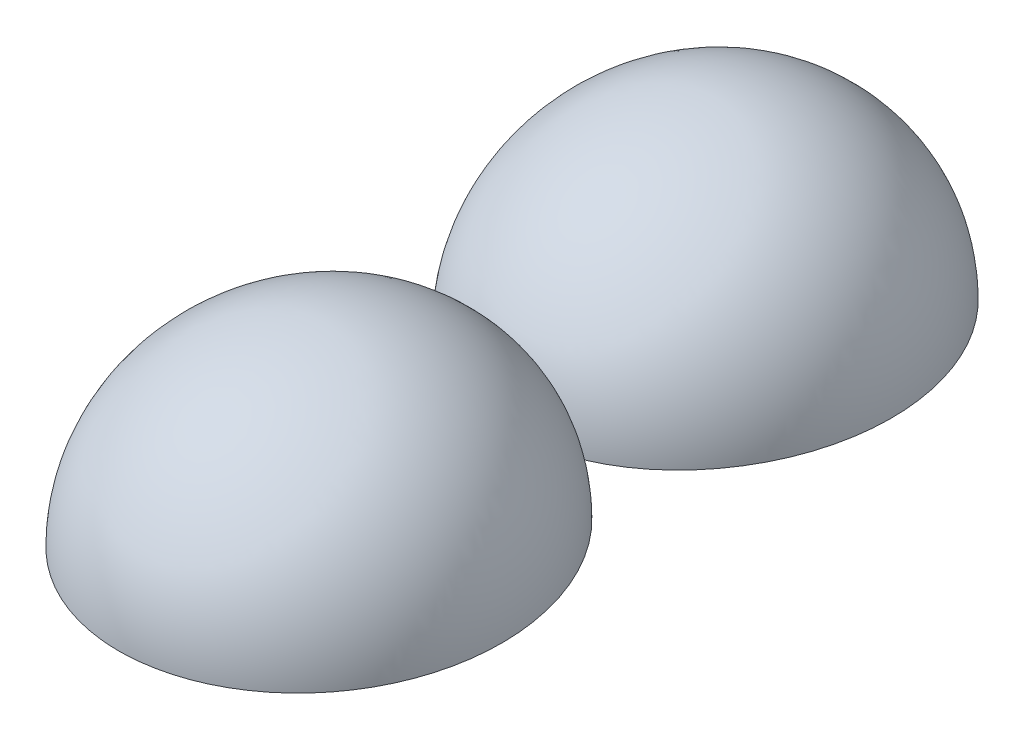
ISO-10303-21;
HEADER;
FILE_DESCRIPTION(('STEP AP214'),'2;1');
FILE_NAME('part.step','',(''),(''),'','','');
FILE_SCHEMA(('AUTOMOTIVE_DESIGN { 1 0 10303 214 1 1 1 1 }'));
ENDSEC;
DATA;
#1=APPLICATION_CONTEXT('core data for automotive mechanical design processes');
#2=APPLICATION_PROTOCOL_DEFINITION('international standard','automotive_design',2000,#1);
#3=PRODUCT_CONTEXT('',#1,'mechanical');
#4=PRODUCT('Part','Part','',(#3));
#5=PRODUCT_RELATED_PRODUCT_CATEGORY('part','',(#4));
#6=PRODUCT_DEFINITION_FORMATION('','',#4);
#7=PRODUCT_DEFINITION_CONTEXT('part definition',#1,'design');
#8=PRODUCT_DEFINITION('design','',#6,#7);
#9=PRODUCT_DEFINITION_SHAPE('','',#8);
#10=(LENGTH_UNIT() NAMED_UNIT(*) SI_UNIT(.MILLI.,.METRE.));
#11=(NAMED_UNIT(*) PLANE_ANGLE_UNIT() SI_UNIT($,.RADIAN.));
#12=(NAMED_UNIT(*) SI_UNIT($,.STERADIAN.) SOLID_ANGLE_UNIT());
#13=UNCERTAINTY_MEASURE_WITH_UNIT(LENGTH_MEASURE(1.E-05),#10,'distance_accuracy_value','');
#14=(GEOMETRIC_REPRESENTATION_CONTEXT(3) GLOBAL_UNCERTAINTY_ASSIGNED_CONTEXT((#13)) GLOBAL_UNIT_ASSIGNED_CONTEXT((#10,
#11,#12)) REPRESENTATION_CONTEXT('',''));
#15=CARTESIAN_POINT('',(0.,0.,0.));
#16=DIRECTION('',(0.,0.,1.));
#17=DIRECTION('',(1.,0.,0.));
#18=AXIS2_PLACEMENT_3D('',#15,#16,#17);
#19=CARTESIAN_POINT('',(3.06028735858265E-13,0.,21.3227192364473));
#20=CARTESIAN_POINT('',(-0.0605600851372698,0.,21.3227192364473));
#21=CARTESIAN_POINT('',(-0.180524470848123,0.,21.3196416488283));
#22=CARTESIAN_POINT('',(-0.367253435553289,0.,21.3081007327531));
#23=CARTESIAN_POINT('',(-0.555099954305753,0.,21.2828538482068));
#24=CARTESIAN_POINT('',(-0.716031376089089,0.,21.2543544839529));
#25=CARTESIAN_POINT('',(-0.844484831998398,0.,21.2271460866288));
#26=CARTESIAN_POINT('',(-1.00384668062234,0.,21.1877226172179));
#27=CARTESIAN_POINT('',(-1.19225597834348,0.,21.1319306277739));
#28=CARTESIAN_POINT('',(-1.40986644893566,0.,21.0543856421346));
#29=CARTESIAN_POINT('',(-1.65358201661449,0.,20.9495379866468));
#30=CARTESIAN_POINT('',(-1.91954629545271,0.,20.8149898556674));
#31=CARTESIAN_POINT('',(-2.20381439490061,0.,20.6455348772837));
#32=CARTESIAN_POINT('',(-2.50037552064583,0.,20.4374653876274));
#33=CARTESIAN_POINT('',(-2.80407151518409,0.,20.187245640245));
#34=CARTESIAN_POINT('',(-3.16020470363246,0.,19.8480703849216));
#35=CARTESIAN_POINT('',(-3.55002285408261,0.,19.404299117935));
#36=CARTESIAN_POINT('',(-3.95126616854423,0.,18.8437311144077));
#37=CARTESIAN_POINT('',(-4.43664961336897,0.,17.9905573006489));
#38=CARTESIAN_POINT('',(-4.89148726452149,0.,16.9017870305576));
#39=CARTESIAN_POINT('',(-5.25626167174152,0.,15.5734800440547));
#40=CARTESIAN_POINT('',(-5.47630484215257,0.,14.0155820653388));
#41=CARTESIAN_POINT('',(-5.52275474623004,0.,12.4409072350932));
#42=CARTESIAN_POINT('',(-5.41325463368996,0.,10.8698472301707));
#43=CARTESIAN_POINT('',(-5.1614088415779,0.,9.31556741862959));
#44=CARTESIAN_POINT('',(-4.777436955626,0.,7.78873548428225));
#45=CARTESIAN_POINT('',(-4.26875583085814,0.,6.29890695017353));
#46=CARTESIAN_POINT('',(-3.64033929904608,0.,4.85548320022228));
#47=CARTESIAN_POINT('',(-2.89456999099136,0.,3.46893515665885));
#48=CARTESIAN_POINT('',(-2.14256222285628,0.,2.32283287604823));
#49=CARTESIAN_POINT('',(-1.42614440038181,0.,1.40222976444919));
#50=CARTESIAN_POINT('',(-0.851142921162116,0.,0.768816275465535));
#51=CARTESIAN_POINT('',(-0.462580630449086,0.,0.387077097571633));
#52=CARTESIAN_POINT('',(-0.195923126656698,0.,0.152384324671856));
#53=CARTESIAN_POINT('',(-0.0663117351554884,0.,0.0495330631106812));
#54=CARTESIAN_POINT('',(0.,0.,0.));
#55=B_SPLINE_CURVE_WITH_KNOTS('',4,(#19,#20,#21,#22,#23,#24,#25,#26,#27,#28,#29,#30,#31,#32,#33,
#34,#35,#36,#37,#38,#39,#40,#41,#42,#43,#44,#45,#46,#47,#48,#49,#50,#51,#52,#53,#54),
.UNSPECIFIED.,.F.,.F.,(5,1,1,1,1,1,1,1,1,1,1,1,1,1,1,1,1,1,1,1,1,1,1,1,1,1,1,1,1,1,1,1,5),
(0.075727273648214,0.0852251902132587,0.0947231067783033,0.0994720692332456,0.104221031688188,
0.10896999414313,0.113718956598072,0.123216879822465,0.132714803046858,0.142432647675104,
0.15215049230335,0.166397447324557,0.180644402345764,0.194891233087148,0.209138063828531,
0.237631810695735,0.266125767747669,0.294619399363612,0.351197461360832,0.408185109509772,
0.465172649296407,0.522160251464682,0.579147822960017,0.636135418479735,0.693122967885307,
0.750110545802865,0.807098279092534,0.864085824216971,0.921073538054691,0.948543207210811,
0.97601287636693,0.988006438183465,1.),.UNSPECIFIED.);
#56=CARTESIAN_POINT('',(0.,0.,0.));
#57=DIRECTION('',(0.,0.,-1.));
#58=AXIS1_PLACEMENT('',#56,#57);
#59=SURFACE_OF_REVOLUTION('',#55,#58);
#60=CARTESIAN_POINT('',(-1.59744263229573E-13,0.,21.3227192364473));
#61=CARTESIAN_POINT('',(0.0605600851374161,0.,21.3227192364473));
#62=CARTESIAN_POINT('',(0.18052447084827,0.,21.3196416488283));
#63=CARTESIAN_POINT('',(0.367253435553436,0.,21.3081007327531));
#64=CARTESIAN_POINT('',(0.555099954305899,0.,21.2828538482068));
#65=CARTESIAN_POINT('',(0.716031376089234,0.,21.2543544839529));
#66=CARTESIAN_POINT('',(0.844484831998543,0.,21.2271460866288));
#67=CARTESIAN_POINT('',(1.00384668062249,0.,21.1877226172179));
#68=CARTESIAN_POINT('',(1.19225597834363,0.,21.1319306277738));
#69=CARTESIAN_POINT('',(1.40986644893581,0.,21.0543856421346));
#70=CARTESIAN_POINT('',(1.65358201661464,0.,20.9495379866467));
#71=CARTESIAN_POINT('',(1.91954629545285,0.,20.8149898556674));
#72=CARTESIAN_POINT('',(2.20381439490075,0.,20.6455348772837));
#73=CARTESIAN_POINT('',(2.50037552064597,0.,20.4374653876273));
#74=CARTESIAN_POINT('',(2.80407151518423,0.,20.187245640245));
#75=CARTESIAN_POINT('',(3.16020470363259,0.,19.8480703849216));
#76=CARTESIAN_POINT('',(3.55002285408275,0.,19.404299117935));
#77=CARTESIAN_POINT('',(3.95126616854436,0.,18.8437311144076));
#78=CARTESIAN_POINT('',(4.43664961336909,0.,17.9905573006488));
#79=CARTESIAN_POINT('',(4.89148726452161,0.,16.9017870305576));
#80=CARTESIAN_POINT('',(5.25626167174163,0.,15.5734800440547));
#81=CARTESIAN_POINT('',(5.47630484215267,0.,14.0155820653388));
#82=CARTESIAN_POINT('',(5.52275474623012,0.,12.4409072350931));
#83=CARTESIAN_POINT('',(5.41325463369003,0.,10.8698472301706));
#84=CARTESIAN_POINT('',(5.16140884157796,0.,9.31556741862955));
#85=CARTESIAN_POINT('',(4.77743695562606,0.,7.78873548428222));
#86=CARTESIAN_POINT('',(4.26875583085819,0.,6.2989069501735));
#87=CARTESIAN_POINT('',(3.64033929904611,0.,4.85548320022225));
#88=CARTESIAN_POINT('',(2.89456999099139,0.,3.46893515665883));
#89=CARTESIAN_POINT('',(2.1425622228563,0.,2.32283287604821));
#90=CARTESIAN_POINT('',(1.42614440038182,0.,1.40222976444918));
#91=CARTESIAN_POINT('',(0.851142921162121,0.,0.768816275465529));
#92=CARTESIAN_POINT('',(0.462580630449089,0.,0.387077097571629));
#93=CARTESIAN_POINT('',(0.195923126656699,0.,0.152384324671855));
#94=CARTESIAN_POINT('',(0.0663117351554888,0.,0.0495330631106807));
#95=CARTESIAN_POINT('',(0.,0.,0.));
#96=B_SPLINE_CURVE_WITH_KNOTS('',4,(#60,#61,#62,#63,#64,#65,#66,#67,#68,#69,#70,#71,#72,#73,#74,
#75,#76,#77,#78,#79,#80,#81,#82,#83,#84,#85,#86,#87,#88,#89,#90,#91,#92,#93,#94,#95),
.UNSPECIFIED.,.F.,.F.,(5,1,1,1,1,1,1,1,1,1,1,1,1,1,1,1,1,1,1,1,1,1,1,1,1,1,1,1,1,1,1,1,5),
(0.075727273648214,0.0852251902132587,0.0947231067783033,0.0994720692332456,0.104221031688188,
0.10896999414313,0.113718956598072,0.123216879822465,0.132714803046858,0.142432647675104,
0.15215049230335,0.166397447324557,0.180644402345764,0.194891233087148,0.209138063828531,
0.237631810695735,0.266125767747669,0.294619399363612,0.351197461360832,0.408185109509772,
0.465172649296407,0.522160251464682,0.579147822960017,0.636135418479735,0.693122967885307,
0.750110545802865,0.807098279092534,0.864085824216971,0.921073538054691,0.948543207210811,
0.97601287636693,0.988006438183465,1.),.UNSPECIFIED.);
#97=CARTESIAN_POINT('',(1.4497883263559E-13,0.,21.3227192364473));
#98=VERTEX_POINT('',#97);
#99=CARTESIAN_POINT('',(0.,0.,0.));
#100=VERTEX_POINT('',#99);
#101=EDGE_CURVE('P0_E27',#98,#100,#96,.T.);
#102=ORIENTED_EDGE('',*,*,#101,.T.);
#103=EDGE_CURVE('P0_E11',#98,#100,#55,.T.);
#104=ORIENTED_EDGE('',*,*,#103,.F.);
#105=EDGE_LOOP('',(#102,#104));
#106=FACE_BOUND('',#105,.T.);
#107=ADVANCED_FACE('P0_F17',(#106),#59,.T.);
#108=CARTESIAN_POINT('',(-5.42041091230144,0.,11.2243457893201));
#109=DIRECTION('',(0.,1.,0.));
#110=DIRECTION('',(0.,0.,-1.));
#111=AXIS2_PLACEMENT_3D('',#108,#109,#110);
#112=PLANE('',#111);
#113=ORIENTED_EDGE('',*,*,#103,.T.);
#114=ORIENTED_EDGE('',*,*,#101,.F.);
#115=EDGE_LOOP('',(#113,#114));
#116=FACE_BOUND('',#115,.T.);
#117=ADVANCED_FACE('P0_F34',(#116),#112,.F.);
#118=CLOSED_SHELL('',(#107,#117));
#119=MANIFOLD_SOLID_BREP('P0_B1',#118);
#120=CARTESIAN_POINT('',(2.07386554913813E-12,0.,0.));
#121=CARTESIAN_POINT('',(-0.0479863208393457,0.,0.0321703262097624));
#122=CARTESIAN_POINT('',(-0.145134861787362,0.,0.0946417333582184));
#123=CARTESIAN_POINT('',(-0.344202177756289,0.,0.212012112728412));
#124=CARTESIAN_POINT('',(-0.649410607301891,0.,0.376321721449868));
#125=CARTESIAN_POINT('',(-1.01178827318737,0.,0.555730005310857));
#126=CARTESIAN_POINT('',(-1.43242484901607,0.,0.747093766717329));
#127=CARTESIAN_POINT('',(-1.8580310883749,0.,0.927038839520863));
#128=CARTESIAN_POINT('',(-2.39525808021264,0.,1.1392078014803));
#129=CARTESIAN_POINT('',(-3.05778948779468,0.,1.3793736094263));
#130=CARTESIAN_POINT('',(-3.84838735570272,0.,1.63802458522609));
#131=CARTESIAN_POINT('',(-5.00215548509229,0.,1.97326411091218));
#132=CARTESIAN_POINT('',(-6.41543920888815,0.,2.32276693782154));
#133=CARTESIAN_POINT('',(-8.08061631008433,0.,2.65812280227645));
#134=CARTESIAN_POINT('',(-10.0715697689984,0.,2.96538096190314));
#135=CARTESIAN_POINT('',(-12.1467731358893,0.,3.19521110168923));
#136=CARTESIAN_POINT('',(-14.3027932474081,0.,3.345727050951));
#137=CARTESIAN_POINT('',(-16.5362981719592,-1.1547235296189E-13,3.41472517118743));
#138=CARTESIAN_POINT('',(-19.7079432041989,-1.37619831848889E-13,3.39857422575522));
#139=CARTESIAN_POINT('',(-23.0648185664982,-1.6106076721747E-13,3.20532305357224));
#140=CARTESIAN_POINT('',(-26.59557673471,-1.85715919730028E-13,2.82286693544886));
#141=CARTESIAN_POINT('',(-30.2890453566026,-2.1150727326791E-13,2.23743411660248));
#142=CARTESIAN_POINT('',(-33.2255239502246,-2.32012593690997E-13,1.66595198747096));
#143=CARTESIAN_POINT('',(-36.8702423586542,-2.57463526307737E-13,0.829296860920982));
#144=CARTESIAN_POINT('',(-41.1979321500885,-2.87683622601926E-13,-0.360314402722459));
#145=CARTESIAN_POINT('',(-46.1718067459134,-3.22416003268063E-13,-2.00056274204736));
#146=CARTESIAN_POINT('',(-53.2002912903775,-3.71495648522751E-13,-4.76669159526652));
#147=CARTESIAN_POINT('',(-64.0662718649665,-4.4737238533157E-13,-9.97458895910713));
#148=CARTESIAN_POINT('',(-78.0879986462571,-5.45285580122036E-13,-18.8247698956133));
#149=CARTESIAN_POINT('',(-94.0780397445643,-6.56943440326184E-13,-32.6027109217908));
#150=CARTESIAN_POINT('',(-109.522130393088,-7.6478894891563E-13,-51.0060171862142));
#151=CARTESIAN_POINT('',(-121.993292050705,-8.51874605318156E-13,-71.5305091027313));
#152=CARTESIAN_POINT('',(-130.15814508519,-9.08889469326759E-13,-90.8896994358743));
#153=CARTESIAN_POINT('',(-135.10771528345,-9.434521332918E-13,-108.176937844795));
#154=CARTESIAN_POINT('',(-138.376785104317,-9.66279925841665E-13,-125.838291985251));
#155=CARTESIAN_POINT('',(-139.680812788272,-9.75385902489389E-13,-140.76642516533));
#156=CARTESIAN_POINT('',(-139.53990217952,-9.74401928967587E-13,-155.751586100403));
#157=CARTESIAN_POINT('',(-137.941693761858,-9.63241699235888E-13,-170.634378490997));
#158=CARTESIAN_POINT('',(-135.786987086062,-9.48195462937439E-13,-182.413843163642));
#159=CARTESIAN_POINT('',(-132.757744461827,-9.27042374750749E-13,-193.999573998504));
#160=CARTESIAN_POINT('',(-128.859639270352,-8.99822051684984E-13,-205.322900290727));
#161=CARTESIAN_POINT('',(-124.102852164729,-8.66605584860722E-13,-216.313556294855));
#162=CARTESIAN_POINT('',(-118.502761106392,-8.27500358008706E-13,-226.89985439899));
#163=CARTESIAN_POINT('',(-112.080527474755,-7.82654140251605E-13,-237.009041725339));
#164=CARTESIAN_POINT('',(-104.863770349494,-7.32259794591979E-13,-246.567787483469));
#165=CARTESIAN_POINT('',(-96.8871562187137,-6.76559395822438E-13,-255.502869604249));
#166=CARTESIAN_POINT('',(-88.192954370992,-6.15848108807526E-13,-263.742039758038));
#167=CARTESIAN_POINT('',(-80.0016390851504,-5.58648459885333E-13,-270.280947104679));
#168=CARTESIAN_POINT('',(-72.6000508032795,-5.06963445157428E-13,-275.365034326222));
#169=CARTESIAN_POINT('',(-66.1992969321918,-4.62267219766567E-13,-279.23517287352));
#170=CARTESIAN_POINT('',(-60.9479068793383,-4.25596959021518E-13,-282.103901172911));
#171=CARTESIAN_POINT('',(-55.5750626208033,-3.88078588091147E-13,-284.738225891423));
#172=CARTESIAN_POINT('',(-50.0906272085948,-3.49780980299514E-13,-287.131575809175));
#173=CARTESIAN_POINT('',(-44.5048242990486,-3.10775527057241E-13,-289.277874601187));
#174=CARTESIAN_POINT('',(-38.828450490917,-2.71137620610462E-13,-291.171584885398));
#175=CARTESIAN_POINT('',(-33.0724414368496,-2.30943624213486E-13,-292.807749888578));
#176=CARTESIAN_POINT('',(-27.2485048282709,-1.9027529223857E-13,-294.182032130039));
#177=CARTESIAN_POINT('',(-22.1029726390701,-1.54344233004547E-13,-295.152158828091));
#178=CARTESIAN_POINT('',(-18.0350942367525,-1.25938389943798E-13,-295.760536134997));
#179=CARTESIAN_POINT('',(-15.065690799796,-1.05203156568537E-13,-296.124160412145));
#180=CARTESIAN_POINT('',(-13.2078311469778,0.,-296.323196206307));
#181=CARTESIAN_POINT('',(-11.7170445283904,0.,-296.465459961173));
#182=CARTESIAN_POINT('',(-10.2307831062727,0.,-296.590734539412));
#183=CARTESIAN_POINT('',(-8.73230350409256,0.,-296.698998443845));
#184=CARTESIAN_POINT('',(-7.21850583353519,0.,-296.792207093271));
#185=CARTESIAN_POINT('',(-5.64317292437778,0.,-296.869094234134));
#186=CARTESIAN_POINT('',(-4.07854022025919,0.,-296.928362498182));
#187=CARTESIAN_POINT('',(-2.61412262196324,0.,-296.96364404572));
#188=CARTESIAN_POINT('',(-1.46310281447096,0.,-296.981286093145));
#189=CARTESIAN_POINT('',(-0.559088915756624,0.,-296.986326825011));
#190=CARTESIAN_POINT('',(-0.184648694079104,0.,-296.987166947344));
#191=CARTESIAN_POINT('',(1.62589145400589E-10,0.,-296.987166947343));
#192=B_SPLINE_CURVE_WITH_KNOTS('',4,(#120,#121,#122,#123,#124,#125,#126,#127,#128,#129,#130,
#131,#132,#133,#134,#135,#136,#137,#138,#139,#140,#141,#142,#143,#144,#145,#146,#147,#148,#149,
#150,#151,#152,#153,#154,#155,#156,#157,#158,#159,#160,#161,#162,#163,#164,#165,#166,#167,#168,
#169,#170,#171,#172,#173,#174,#175,#176,#177,#178,#179,#180,#181,#182,#183,#184,#185,#186,#187,
#188,#189,#190,#191),.UNSPECIFIED.,.F.,.F.,(5,1,1,1,1,1,1,1,1,1,1,1,1,1,1,1,1,1,1,1,1,1,1,1,1,1,
1,1,1,1,1,1,1,1,1,1,1,1,1,1,1,1,1,1,1,1,1,1,1,1,1,1,1,1,1,1,1,1,1,1,1,1,1,1,1,1,1,1,5),(0.,
0.000458674137903002,0.000917348275806004,0.00183469655161201,0.00275204482741801,
0.00366939310322401,0.00458674137903002,0.00550408965483602,0.00733878620644803,
0.00926515636266851,0.011191526518889,0.01504426683133,0.0188970071437709,0.0227497474562119,
0.0271852996393439,0.0316208518224759,0.0360564040056079,0.0404919561887399,0.0523686588342327,
0.0583070101569791,0.0642453614797256,0.0701838779914301,0.0761223945031346,0.0879994275265436,
0.0998762104815178,0.111752993436492,0.136078927552254,0.183585527710117,0.231092168472181,
0.278599012887844,0.326105735545153,0.373612429891048,0.3973658263705,0.421119222849953,
0.468625937647202,0.492379295105644,0.516132652564086,0.539886019817049,0.563639387070011,
0.587392748350968,0.611146109631925,0.634899475453517,0.658652841275109,0.682406203776029,
0.706159566276949,0.7299129268991,0.753666287521252,0.765542968356271,0.777419649191289,
0.789296330026308,0.801173010861327,0.81304968982068,0.824926368780033,0.836803047739386,
0.848679726698739,0.860556404824788,0.872433082950836,0.87837142201386,0.881340591545372,
0.884309761076884,0.887278930608396,0.890248100139908,0.89321726967142,0.896186439202932,
0.899412568707219,0.902638698211505,0.905864827715792,0.907477892467935,0.909090957220078),.UNSPECIFIED.);
#193=CARTESIAN_POINT('',(0.,0.,-296.987166947343));
#194=DIRECTION('',(0.,0.,-1.));
#195=AXIS1_PLACEMENT('',#193,#194);
#196=SURFACE_OF_REVOLUTION('',#192,#195);
#197=CARTESIAN_POINT('',(0.,0.,0.));
#198=CARTESIAN_POINT('',(0.0479863208414198,0.,0.0321703262097621));
#199=CARTESIAN_POINT('',(0.145134861789436,0.,0.0946417333582174));
#200=CARTESIAN_POINT('',(0.344202177758364,0.,0.21201211272841));
#201=CARTESIAN_POINT('',(0.649410607303967,0.,0.376321721449864));
#202=CARTESIAN_POINT('',(1.01178827318945,0.,0.55573000531085));
#203=CARTESIAN_POINT('',(1.43242484901815,0.,0.747093766717319));
#204=CARTESIAN_POINT('',(1.85803108837698,0.,0.92703883952085));
#205=CARTESIAN_POINT('',(2.39525808021472,0.,1.13920780148028));
#206=CARTESIAN_POINT('',(3.05778948779677,0.,1.37937360942628));
#207=CARTESIAN_POINT('',(3.8483873557048,0.,1.63802458522606));
#208=CARTESIAN_POINT('',(5.00215548509438,0.,1.97326411091214));
#209=CARTESIAN_POINT('',(6.41543920889024,0.,2.32276693782149));
#210=CARTESIAN_POINT('',(8.08061631008642,0.,2.6581228022764));
#211=CARTESIAN_POINT('',(10.0715697690005,0.,2.96538096190307));
#212=CARTESIAN_POINT('',(12.1467731358914,0.,3.19521110168914));
#213=CARTESIAN_POINT('',(14.3027932474102,0.,3.3457270509509));
#214=CARTESIAN_POINT('',(16.5362981719613,0.,3.41472517118732));
#215=CARTESIAN_POINT('',(19.707943204201,0.,3.39857422575509));
#216=CARTESIAN_POINT('',(23.0648185665003,0.,3.20532305357208));
#217=CARTESIAN_POINT('',(26.5955767347121,0.,2.82286693544867));
#218=CARTESIAN_POINT('',(30.2890453566047,0.,2.23743411660227));
#219=CARTESIAN_POINT('',(33.2255239502267,0.,1.66595198747073));
#220=CARTESIAN_POINT('',(36.8702423586563,0.,0.829296860920729));
#221=CARTESIAN_POINT('',(41.1979321500905,0.,-0.360314402722741));
#222=CARTESIAN_POINT('',(46.1718067459154,0.,-2.00056274204767));
#223=CARTESIAN_POINT('',(53.2002912903795,0.,-4.76669159526689));
#224=CARTESIAN_POINT('',(64.0662718649685,0.,-9.97458895910756));
#225=CARTESIAN_POINT('',(78.087998646259,0.,-18.8247698956139));
#226=CARTESIAN_POINT('',(94.0780397445662,0.,-32.6027109217914));
#227=CARTESIAN_POINT('',(109.52213039309,0.,-51.0060171862149));
#228=CARTESIAN_POINT('',(121.993292050706,0.,-71.5305091027322));
#229=CARTESIAN_POINT('',(130.158145085191,0.,-90.8896994358752));
#230=CARTESIAN_POINT('',(135.107715283452,0.,-108.176937844796));
#231=CARTESIAN_POINT('',(138.376785104319,0.,-125.838291985251));
#232=CARTESIAN_POINT('',(139.680812788273,0.,-140.76642516533));
#233=CARTESIAN_POINT('',(139.539902179521,0.,-155.751586100404));
#234=CARTESIAN_POINT('',(137.941693761859,0.,-170.634378490998));
#235=CARTESIAN_POINT('',(135.786987086063,0.,-182.413843163642));
#236=CARTESIAN_POINT('',(132.757744461827,0.,-193.999573998505));
#237=CARTESIAN_POINT('',(128.859639270352,0.,-205.322900290728));
#238=CARTESIAN_POINT('',(124.10285216473,0.,-216.313556294856));
#239=CARTESIAN_POINT('',(118.502761106392,0.,-226.899854398991));
#240=CARTESIAN_POINT('',(112.080527474755,0.,-237.00904172534));
#241=CARTESIAN_POINT('',(104.863770349494,0.,-246.56778748347));
#242=CARTESIAN_POINT('',(96.887156218714,0.,-255.502869604249));
#243=CARTESIAN_POINT('',(88.1929543709923,0.,-263.742039758038));
#244=CARTESIAN_POINT('',(80.0016390851506,0.,-270.280947104679));
#245=CARTESIAN_POINT('',(72.6000508032797,0.,-275.365034326223));
#246=CARTESIAN_POINT('',(66.1992969321919,0.,-279.23517287352));
#247=CARTESIAN_POINT('',(60.9479068793384,0.,-282.103901172911));
#248=CARTESIAN_POINT('',(55.5750626208034,0.,-284.738225891423));
#249=CARTESIAN_POINT('',(50.0906272085949,0.,-287.131575809175));
#250=CARTESIAN_POINT('',(44.5048242990487,0.,-289.277874601188));
#251=CARTESIAN_POINT('',(38.828450490917,0.,-291.171584885399));
#252=CARTESIAN_POINT('',(33.0724414368496,0.,-292.807749888578));
#253=CARTESIAN_POINT('',(27.2485048282709,0.,-294.18203213004));
#254=CARTESIAN_POINT('',(22.1029726390701,0.,-295.152158828091));
#255=CARTESIAN_POINT('',(18.0350942367526,0.,-295.760536134997));
#256=CARTESIAN_POINT('',(15.065690799796,0.,-296.124160412145));
#257=CARTESIAN_POINT('',(13.2078311469778,0.,-296.323196206307));
#258=CARTESIAN_POINT('',(11.7170445283904,0.,-296.465459961173));
#259=CARTESIAN_POINT('',(10.2307831062727,0.,-296.590734539412));
#260=CARTESIAN_POINT('',(8.7323035040926,0.,-296.698998443845));
#261=CARTESIAN_POINT('',(7.21850583353523,0.,-296.792207093271));
#262=CARTESIAN_POINT('',(5.64317292437782,0.,-296.869094234134));
#263=CARTESIAN_POINT('',(4.07854022025923,0.,-296.928362498182));
#264=CARTESIAN_POINT('',(2.61412262196328,0.,-296.96364404572));
#265=CARTESIAN_POINT('',(1.46310281447099,0.,-296.981286093145));
#266=CARTESIAN_POINT('',(0.559088915756661,0.,-296.986326825011));
#267=CARTESIAN_POINT('',(0.18464869407914,0.,-296.987166947344));
#268=CARTESIAN_POINT('',(-1.6255277496225E-10,0.,-296.987166947343));
#269=B_SPLINE_CURVE_WITH_KNOTS('',4,(#197,#198,#199,#200,#201,#202,#203,#204,#205,#206,#207,
#208,#209,#210,#211,#212,#213,#214,#215,#216,#217,#218,#219,#220,#221,#222,#223,#224,#225,#226,
#227,#228,#229,#230,#231,#232,#233,#234,#235,#236,#237,#238,#239,#240,#241,#242,#243,#244,#245,
#246,#247,#248,#249,#250,#251,#252,#253,#254,#255,#256,#257,#258,#259,#260,#261,#262,#263,#264,
#265,#266,#267,#268),.UNSPECIFIED.,.F.,.F.,(5,1,1,1,1,1,1,1,1,1,1,1,1,1,1,1,1,1,1,1,1,1,1,1,1,1,
1,1,1,1,1,1,1,1,1,1,1,1,1,1,1,1,1,1,1,1,1,1,1,1,1,1,1,1,1,1,1,1,1,1,1,1,1,1,1,1,1,1,5),(0.,
0.000458674137903002,0.000917348275806004,0.00183469655161201,0.00275204482741801,
0.00366939310322401,0.00458674137903002,0.00550408965483602,0.00733878620644803,
0.00926515636266851,0.011191526518889,0.01504426683133,0.0188970071437709,0.0227497474562119,
0.0271852996393439,0.0316208518224759,0.0360564040056079,0.0404919561887399,0.0523686588342327,
0.0583070101569791,0.0642453614797256,0.0701838779914301,0.0761223945031346,0.0879994275265436,
0.0998762104815178,0.111752993436492,0.136078927552254,0.183585527710117,0.231092168472181,
0.278599012887844,0.326105735545153,0.373612429891048,0.3973658263705,0.421119222849953,
0.468625937647202,0.492379295105644,0.516132652564086,0.539886019817049,0.563639387070011,
0.587392748350968,0.611146109631925,0.634899475453517,0.658652841275109,0.682406203776029,
0.706159566276949,0.7299129268991,0.753666287521252,0.765542968356271,0.777419649191289,
0.789296330026308,0.801173010861327,0.81304968982068,0.824926368780033,0.836803047739386,
0.848679726698739,0.860556404824788,0.872433082950836,0.87837142201386,0.881340591545372,
0.884309761076884,0.887278930608396,0.890248100139908,0.89321726967142,0.896186439202932,
0.899412568707219,0.902638698211505,0.905864827715792,0.907477892467935,0.909090957220078),.UNSPECIFIED.);
#270=CARTESIAN_POINT('',(2.07385030254508E-12,0.,0.));
#271=VERTEX_POINT('',#270);
#272=CARTESIAN_POINT('',(0.,0.,-296.987166947343));
#273=VERTEX_POINT('',#272);
#274=EDGE_CURVE('P1_E27',#271,#273,#269,.T.);
#275=ORIENTED_EDGE('',*,*,#274,.T.);
#276=EDGE_CURVE('P1_E11',#271,#273,#192,.T.);
#277=ORIENTED_EDGE('',*,*,#276,.F.);
#278=EDGE_LOOP('',(#275,#277));
#279=FACE_BOUND('',#278,.T.);
#280=ADVANCED_FACE('P1_F17',(#279),#196,.T.);
#281=CARTESIAN_POINT('',(-139.436774557706,-9.73681792633416E-13,-145.65101687425));
#282=DIRECTION('',(0.,1.,0.));
#283=DIRECTION('',(0.,0.,-1.));
#284=AXIS2_PLACEMENT_3D('',#281,#282,#283);
#285=PLANE('',#284);
#286=ORIENTED_EDGE('',*,*,#276,.T.);
#287=ORIENTED_EDGE('',*,*,#274,.F.);
#288=EDGE_LOOP('',(#286,#287));
#289=FACE_BOUND('',#288,.T.);
#290=ADVANCED_FACE('P1_F34',(#289),#285,.F.);
#291=CLOSED_SHELL('',(#280,#290));
#292=MANIFOLD_SOLID_BREP('P1_B1',#291);
#293=CARTESIAN_POINT('',(-4.5492448847316E-13,0.,-21.3227192364473));
#294=CARTESIAN_POINT('',(0.0605600851371209,0.,-21.3227192364473));
#295=CARTESIAN_POINT('',(0.180524470847975,0.,-21.3196416488283));
#296=CARTESIAN_POINT('',(0.367253435553141,0.,-21.3081007327531));
#297=CARTESIAN_POINT('',(0.555099954305604,0.,-21.2828538482068));
#298=CARTESIAN_POINT('',(0.71603137608894,0.,-21.2543544839529));
#299=CARTESIAN_POINT('',(0.84448483199825,0.,-21.2271460866288));
#300=CARTESIAN_POINT('',(1.0038466806222,0.,-21.1877226172179));
#301=CARTESIAN_POINT('',(1.19225597834334,0.,-21.1319306277739));
#302=CARTESIAN_POINT('',(1.40986644893552,0.,-21.0543856421346));
#303=CARTESIAN_POINT('',(1.65358201661435,0.,-20.9495379866468));
#304=CARTESIAN_POINT('',(1.91954629545256,0.,-20.8149898556674));
#305=CARTESIAN_POINT('',(2.20381439490046,0.,-20.6455348772837));
#306=CARTESIAN_POINT('',(2.50037552064569,0.,-20.4374653876274));
#307=CARTESIAN_POINT('',(2.80407151518395,0.,-20.187245640245));
#308=CARTESIAN_POINT('',(3.16020470363232,0.,-19.8480703849216));
#309=CARTESIAN_POINT('',(3.55002285408248,0.,-19.4042991179351));
#310=CARTESIAN_POINT('',(3.9512661685441,0.,-18.8437311144077));
#311=CARTESIAN_POINT('',(4.43664961336884,0.,-17.9905573006489));
#312=CARTESIAN_POINT('',(4.89148726452138,0.,-16.9017870305576));
#313=CARTESIAN_POINT('',(5.25626167174142,0.,-15.5734800440547));
#314=CARTESIAN_POINT('',(5.47630484215247,0.,-14.0155820653389));
#315=CARTESIAN_POINT('',(5.52275474622995,0.,-12.4409072350932));
#316=CARTESIAN_POINT('',(5.41325463368988,0.,-10.8698472301707));
#317=CARTESIAN_POINT('',(5.16140884157783,0.,-9.31556741862962));
#318=CARTESIAN_POINT('',(4.77743695562595,0.,-7.78873548428228));
#319=CARTESIAN_POINT('',(4.2687558308581,0.,-6.29890695017356));
#320=CARTESIAN_POINT('',(3.64033929904605,0.,-4.8554832002223));
#321=CARTESIAN_POINT('',(2.89456999099134,0.,-3.46893515665887));
#322=CARTESIAN_POINT('',(2.14256222285626,0.,-2.32283287604824));
#323=CARTESIAN_POINT('',(1.4261444003818,0.,-1.4022297644492));
#324=CARTESIAN_POINT('',(0.85114292116211,0.,-0.768816275465541));
#325=CARTESIAN_POINT('',(0.462580630449084,0.,-0.387077097571636));
#326=CARTESIAN_POINT('',(0.195923126656697,0.,-0.152384324671858));
#327=CARTESIAN_POINT('',(0.0663117351554881,0.,-0.0495330631106816));
#328=CARTESIAN_POINT('',(0.,0.,0.));
#329=B_SPLINE_CURVE_WITH_KNOTS('',4,(#293,#294,#295,#296,#297,#298,#299,#300,#301,#302,#303,
#304,#305,#306,#307,#308,#309,#310,#311,#312,#313,#314,#315,#316,#317,#318,#319,#320,#321,#322,
#323,#324,#325,#326,#327,#328),.UNSPECIFIED.,.F.,.F.,(5,1,1,1,1,1,1,1,1,1,1,1,1,1,1,1,1,1,1,1,1,
1,1,1,1,1,1,1,1,1,1,1,5),(0.075727273648214,0.0852251902132587,0.0947231067783033,
0.0994720692332456,0.104221031688188,0.10896999414313,0.113718956598072,0.123216879822465,
0.132714803046858,0.142432647675104,0.15215049230335,0.166397447324557,0.180644402345764,
0.194891233087148,0.209138063828531,0.237631810695735,0.266125767747669,0.294619399363612,
0.351197461360832,0.408185109509772,0.465172649296407,0.522160251464682,0.579147822960017,
0.636135418479735,0.693122967885307,0.750110545802865,0.807098279092534,0.864085824216971,
0.921073538054691,0.948543207210811,0.97601287636693,0.988006438183465,1.),.UNSPECIFIED.);
#330=CARTESIAN_POINT('',(0.,0.,0.));
#331=DIRECTION('',(0.,0.,1.));
#332=AXIS1_PLACEMENT('',#330,#331);
#333=SURFACE_OF_REVOLUTION('',#329,#332);
#334=CARTESIAN_POINT('',(0.,0.,-21.3227192364473));
#335=CARTESIAN_POINT('',(-0.0605600851375649,0.,-21.3227192364473));
#336=CARTESIAN_POINT('',(-0.180524470848419,0.,-21.3196416488283));
#337=CARTESIAN_POINT('',(-0.367253435553584,0.,-21.308100732753));
#338=CARTESIAN_POINT('',(-0.555099954306048,0.,-21.2828538482068));
#339=CARTESIAN_POINT('',(-0.716031376089383,0.,-21.2543544839529));
#340=CARTESIAN_POINT('',(-0.844484831998692,0.,-21.2271460866288));
#341=CARTESIAN_POINT('',(-1.00384668062264,0.,-21.1877226172179));
#342=CARTESIAN_POINT('',(-1.19225597834378,0.,-21.1319306277738));
#343=CARTESIAN_POINT('',(-1.40986644893595,0.,-21.0543856421346));
#344=CARTESIAN_POINT('',(-1.65358201661478,0.,-20.9495379866467));
#345=CARTESIAN_POINT('',(-1.919546295453,0.,-20.8149898556673));
#346=CARTESIAN_POINT('',(-2.20381439490089,0.,-20.6455348772836));
#347=CARTESIAN_POINT('',(-2.50037552064611,0.,-20.4374653876273));
#348=CARTESIAN_POINT('',(-2.80407151518437,0.,-20.1872456402449));
#349=CARTESIAN_POINT('',(-3.16020470363273,0.,-19.8480703849215));
#350=CARTESIAN_POINT('',(-3.55002285408288,0.,-19.404299117935));
#351=CARTESIAN_POINT('',(-3.95126616854449,0.,-18.8437311144076));
#352=CARTESIAN_POINT('',(-4.43664961336922,0.,-17.9905573006488));
#353=CARTESIAN_POINT('',(-4.89148726452173,0.,-16.9017870305575));
#354=CARTESIAN_POINT('',(-5.25626167174174,0.,-15.5734800440546));
#355=CARTESIAN_POINT('',(-5.47630484215277,0.,-14.0155820653388));
#356=CARTESIAN_POINT('',(-5.52275474623021,0.,-12.4409072350931));
#357=CARTESIAN_POINT('',(-5.41325463369011,0.,-10.8698472301706));
#358=CARTESIAN_POINT('',(-5.16140884157803,0.,-9.31556741862952));
#359=CARTESIAN_POINT('',(-4.77743695562611,0.,-7.78873548428218));
#360=CARTESIAN_POINT('',(-4.26875583085823,0.,-6.29890695017347));
#361=CARTESIAN_POINT('',(-3.64033929904615,0.,-4.85548320022223));
#362=CARTESIAN_POINT('',(-2.89456999099141,0.,-3.46893515665881));
#363=CARTESIAN_POINT('',(-2.14256222285631,0.,-2.3228328760482));
#364=CARTESIAN_POINT('',(-1.42614440038183,0.,-1.40222976444917));
#365=CARTESIAN_POINT('',(-0.851142921162126,0.,-0.768816275465523));
#366=CARTESIAN_POINT('',(-0.462580630449092,0.,-0.387077097571626));
#367=CARTESIAN_POINT('',(-0.1959231266567,0.,-0.152384324671854));
#368=CARTESIAN_POINT('',(-0.0663117351554891,0.,-0.0495330631106803));
#369=CARTESIAN_POINT('',(0.,0.,0.));
#370=B_SPLINE_CURVE_WITH_KNOTS('',4,(#334,#335,#336,#337,#338,#339,#340,#341,#342,#343,#344,
#345,#346,#347,#348,#349,#350,#351,#352,#353,#354,#355,#356,#357,#358,#359,#360,#361,#362,#363,
#364,#365,#366,#367,#368,#369),.UNSPECIFIED.,.F.,.F.,(5,1,1,1,1,1,1,1,1,1,1,1,1,1,1,1,1,1,1,1,1,
1,1,1,1,1,1,1,1,1,1,1,5),(0.075727273648214,0.0852251902132587,0.0947231067783033,
0.0994720692332456,0.104221031688188,0.10896999414313,0.113718956598072,0.123216879822465,
0.132714803046858,0.142432647675104,0.15215049230335,0.166397447324557,0.180644402345764,
0.194891233087148,0.209138063828531,0.237631810695735,0.266125767747669,0.294619399363612,
0.351197461360832,0.408185109509772,0.465172649296407,0.522160251464682,0.579147822960017,
0.636135418479735,0.693122967885307,0.750110545802865,0.807098279092534,0.864085824216971,
0.921073538054691,0.948543207210811,0.97601287636693,0.988006438183465,1.),.UNSPECIFIED.);
#371=CARTESIAN_POINT('',(-2.93874585250485E-13,0.,-21.3227192364473));
#372=VERTEX_POINT('',#371);
#373=CARTESIAN_POINT('',(0.,0.,0.));
#374=VERTEX_POINT('',#373);
#375=EDGE_CURVE('P2_E27',#372,#374,#370,.T.);
#376=ORIENTED_EDGE('',*,*,#375,.T.);
#377=EDGE_CURVE('P2_E11',#372,#374,#329,.T.);
#378=ORIENTED_EDGE('',*,*,#377,.F.);
#379=EDGE_LOOP('',(#376,#378));
#380=FACE_BOUND('',#379,.T.);
#381=ADVANCED_FACE('P2_F17',(#380),#333,.T.);
#382=CARTESIAN_POINT('',(5.42041091230136,0.,-11.2243457893201));
#383=DIRECTION('',(0.,1.,0.));
#384=DIRECTION('',(0.,0.,1.));
#385=AXIS2_PLACEMENT_3D('',#382,#383,#384);
#386=PLANE('',#385);
#387=ORIENTED_EDGE('',*,*,#377,.T.);
#388=ORIENTED_EDGE('',*,*,#375,.F.);
#389=EDGE_LOOP('',(#387,#388));
#390=FACE_BOUND('',#389,.T.);
#391=ADVANCED_FACE('P2_F34',(#390),#386,.F.);
#392=CLOSED_SHELL('',(#381,#391));
#393=MANIFOLD_SOLID_BREP('P2_B1',#392);
#394=CARTESIAN_POINT('',(-2.07386554913813E-12,0.,0.));
#395=CARTESIAN_POINT('',(0.0479863208393455,0.,-0.0321703262097628));
#396=CARTESIAN_POINT('',(0.145134861787361,0.,-0.0946417333582194));
#397=CARTESIAN_POINT('',(0.344202177756287,0.,-0.212012112728415));
#398=CARTESIAN_POINT('',(0.649410607301888,0.,-0.376321721449873));
#399=CARTESIAN_POINT('',(1.01178827318737,0.,-0.555730005310864));
#400=CARTESIAN_POINT('',(1.43242484901606,0.,-0.747093766717339));
#401=CARTESIAN_POINT('',(1.8580310883749,0.,-0.927038839520876));
#402=CARTESIAN_POINT('',(2.39525808021263,0.,-1.13920780148031));
#403=CARTESIAN_POINT('',(3.05778948779467,0.,-1.37937360942632));
#404=CARTESIAN_POINT('',(3.84838735570271,0.,-1.63802458522611));
#405=CARTESIAN_POINT('',(5.00215548509228,0.,-1.97326411091221));
#406=CARTESIAN_POINT('',(6.41543920888813,0.,-2.32276693782158));
#407=CARTESIAN_POINT('',(8.08061631008431,0.,-2.65812280227651));
#408=CARTESIAN_POINT('',(10.0715697689983,0.,-2.96538096190321));
#409=CARTESIAN_POINT('',(12.1467731358893,0.,-3.19521110168931));
#410=CARTESIAN_POINT('',(14.3027932474081,0.,-3.3457270509511));
#411=CARTESIAN_POINT('',(16.5362981719592,-1.1547235296189E-13,-3.41472517118755));
#412=CARTESIAN_POINT('',(19.7079432041988,-1.37619831848889E-13,-3.39857422575536));
#413=CARTESIAN_POINT('',(23.0648185664982,-1.6106076721747E-13,-3.2053230535724));
#414=CARTESIAN_POINT('',(26.59557673471,-1.85715919730028E-13,-2.82286693544904));
#415=CARTESIAN_POINT('',(30.2890453566026,-2.1150727326791E-13,-2.23743411660269));
#416=CARTESIAN_POINT('',(33.2255239502246,-2.32012593690997E-13,-1.66595198747119));
#417=CARTESIAN_POINT('',(36.8702423586542,-2.57463526307737E-13,-0.82929686092124));
#418=CARTESIAN_POINT('',(41.1979321500885,-2.87683622601926E-13,0.360314402722171));
#419=CARTESIAN_POINT('',(46.1718067459134,-3.22416003268063E-13,2.00056274204703));
#420=CARTESIAN_POINT('',(53.2002912903775,-3.71495648522751E-13,4.76669159526615));
#421=CARTESIAN_POINT('',(64.0662718649666,-4.4737238533157E-13,9.97458895910668));
#422=CARTESIAN_POINT('',(78.0879986462572,-5.45285580122036E-13,18.8247698956128));
#423=CARTESIAN_POINT('',(94.0780397445645,-6.56943440326184E-13,32.6027109217901));
#424=CARTESIAN_POINT('',(109.522130393089,-7.6478894891563E-13,51.0060171862134));
#425=CARTESIAN_POINT('',(121.993292050705,-8.51874605318156E-13,71.5305091027305));
#426=CARTESIAN_POINT('',(130.15814508519,-9.08889469326759E-13,90.8896994358734));
#427=CARTESIAN_POINT('',(135.107715283451,-9.434521332918E-13,108.176937844794));
#428=CARTESIAN_POINT('',(138.376785104318,-9.66279925841665E-13,125.83829198525));
#429=CARTESIAN_POINT('',(139.680812788273,-9.75385902489389E-13,140.766425165329));
#430=CARTESIAN_POINT('',(139.539902179522,-9.74401928967587E-13,155.751586100402));
#431=CARTESIAN_POINT('',(137.941693761859,-9.63241699235888E-13,170.634378490996));
#432=CARTESIAN_POINT('',(135.786987086063,-9.48195462937439E-13,182.413843163641));
#433=CARTESIAN_POINT('',(132.757744461828,-9.27042374750749E-13,193.999573998504));
#434=CARTESIAN_POINT('',(128.859639270353,-8.99822051684984E-13,205.322900290726));
#435=CARTESIAN_POINT('',(124.102852164731,-8.66605584860722E-13,216.313556294855));
#436=CARTESIAN_POINT('',(118.502761106393,-8.27500358008706E-13,226.899854398989));
#437=CARTESIAN_POINT('',(112.080527474756,-7.82654140251605E-13,237.009041725338));
#438=CARTESIAN_POINT('',(104.863770349495,-7.32259794591979E-13,246.567787483469));
#439=CARTESIAN_POINT('',(96.8871562187155,-6.76559395822438E-13,255.502869604248));
#440=CARTESIAN_POINT('',(88.1929543709939,-6.15848108807526E-13,263.742039758037));
#441=CARTESIAN_POINT('',(80.0016390851523,-5.58648459885333E-13,270.280947104678));
#442=CARTESIAN_POINT('',(72.6000508032814,-5.06963445157428E-13,275.365034326222));
#443=CARTESIAN_POINT('',(66.1992969321937,-4.62267219766567E-13,279.23517287352));
#444=CARTESIAN_POINT('',(60.9479068793402,-4.25596959021518E-13,282.10390117291));
#445=CARTESIAN_POINT('',(55.5750626208053,-3.88078588091147E-13,284.738225891422));
#446=CARTESIAN_POINT('',(50.0906272085968,-3.49780980299514E-13,287.131575809174));
#447=CARTESIAN_POINT('',(44.5048242990506,-3.10775527057241E-13,289.277874601187));
#448=CARTESIAN_POINT('',(38.828450490919,-2.71137620610462E-13,291.171584885398));
#449=CARTESIAN_POINT('',(33.0724414368516,-2.30943624213486E-13,292.807749888577));
#450=CARTESIAN_POINT('',(27.2485048282729,-1.9027529223857E-13,294.182032130039));
#451=CARTESIAN_POINT('',(22.1029726390722,-1.54344233004547E-13,295.152158828091));
#452=CARTESIAN_POINT('',(18.0350942367546,-1.25938389943798E-13,295.760536134997));
#453=CARTESIAN_POINT('',(15.0656907997981,-1.05203156568537E-13,296.124160412144));
#454=CARTESIAN_POINT('',(13.2078311469798,0.,296.323196206307));
#455=CARTESIAN_POINT('',(11.7170445283925,0.,296.465459961173));
#456=CARTESIAN_POINT('',(10.2307831062747,0.,296.590734539411));
#457=CARTESIAN_POINT('',(8.73230350409463,0.,296.698998443844));
#458=CARTESIAN_POINT('',(7.21850583353726,0.,296.792207093271));
#459=CARTESIAN_POINT('',(5.64317292437986,0.,296.869094234134));
#460=CARTESIAN_POINT('',(4.07854022026126,0.,296.928362498182));
#461=CARTESIAN_POINT('',(2.61412262196532,0.,296.96364404572));
#462=CARTESIAN_POINT('',(1.46310281447303,0.,296.981286093145));
#463=CARTESIAN_POINT('',(0.559088915758698,0.,296.986326825011));
#464=CARTESIAN_POINT('',(0.184648694081178,0.,296.987166947344));
#465=CARTESIAN_POINT('',(-1.60515295098044E-10,0.,296.987166947343));
#466=B_SPLINE_CURVE_WITH_KNOTS('',4,(#394,#395,#396,#397,#398,#399,#400,#401,#402,#403,#404,
#405,#406,#407,#408,#409,#410,#411,#412,#413,#414,#415,#416,#417,#418,#419,#420,#421,#422,#423,
#424,#425,#426,#427,#428,#429,#430,#431,#432,#433,#434,#435,#436,#437,#438,#439,#440,#441,#442,
#443,#444,#445,#446,#447,#448,#449,#450,#451,#452,#453,#454,#455,#456,#457,#458,#459,#460,#461,
#462,#463,#464,#465),.UNSPECIFIED.,.F.,.F.,(5,1,1,1,1,1,1,1,1,1,1,1,1,1,1,1,1,1,1,1,1,1,1,1,1,1,
1,1,1,1,1,1,1,1,1,1,1,1,1,1,1,1,1,1,1,1,1,1,1,1,1,1,1,1,1,1,1,1,1,1,1,1,1,1,1,1,1,1,5),(0.,
0.000458674137903002,0.000917348275806004,0.00183469655161201,0.00275204482741801,
0.00366939310322401,0.00458674137903002,0.00550408965483602,0.00733878620644803,
0.00926515636266851,0.011191526518889,0.01504426683133,0.0188970071437709,0.0227497474562119,
0.0271852996393439,0.0316208518224759,0.0360564040056079,0.0404919561887399,0.0523686588342327,
0.0583070101569791,0.0642453614797256,0.0701838779914301,0.0761223945031346,0.0879994275265436,
0.0998762104815178,0.111752993436492,0.136078927552254,0.183585527710117,0.231092168472181,
0.278599012887844,0.326105735545153,0.373612429891048,0.3973658263705,0.421119222849953,
0.468625937647202,0.492379295105644,0.516132652564086,0.539886019817049,0.563639387070011,
0.587392748350968,0.611146109631925,0.634899475453517,0.658652841275109,0.682406203776029,
0.706159566276949,0.7299129268991,0.753666287521252,0.765542968356271,0.777419649191289,
0.789296330026308,0.801173010861327,0.81304968982068,0.824926368780033,0.836803047739386,
0.848679726698739,0.860556404824788,0.872433082950836,0.87837142201386,0.881340591545372,
0.884309761076884,0.887278930608396,0.890248100139908,0.89321726967142,0.896186439202932,
0.899412568707219,0.902638698211505,0.905864827715792,0.907477892467935,0.909090957220078),.UNSPECIFIED.);
#467=CARTESIAN_POINT('',(2.05566508337558E-12,0.,296.987166947343));
#468=DIRECTION('',(0.,0.,1.));
#469=AXIS1_PLACEMENT('',#467,#468);
#470=SURFACE_OF_REVOLUTION('',#466,#469);
#471=CARTESIAN_POINT('',(0.,0.,0.));
#472=CARTESIAN_POINT('',(-0.04798632084142,0.,-0.0321703262097618));
#473=CARTESIAN_POINT('',(-0.145134861789437,0.,-0.0946417333582164));
#474=CARTESIAN_POINT('',(-0.344202177758366,0.,-0.212012112728408));
#475=CARTESIAN_POINT('',(-0.64941060730397,0.,-0.376321721449859));
#476=CARTESIAN_POINT('',(-1.01178827318945,0.,-0.555730005310843));
#477=CARTESIAN_POINT('',(-1.43242484901815,0.,-0.747093766717309));
#478=CARTESIAN_POINT('',(-1.85803108837699,0.,-0.927038839520837));
#479=CARTESIAN_POINT('',(-2.39525808021473,0.,-1.13920780148026));
#480=CARTESIAN_POINT('',(-3.05778948779678,0.,-1.37937360942626));
#481=CARTESIAN_POINT('',(-3.84838735570481,0.,-1.63802458522603));
#482=CARTESIAN_POINT('',(-5.00215548509439,0.,-1.97326411091211));
#483=CARTESIAN_POINT('',(-6.41543920889026,0.,-2.32276693782145));
#484=CARTESIAN_POINT('',(-8.08061631008644,0.,-2.65812280227634));
#485=CARTESIAN_POINT('',(-10.0715697690005,0.,-2.965380961903));
#486=CARTESIAN_POINT('',(-12.1467731358914,0.,-3.19521110168906));
#487=CARTESIAN_POINT('',(-14.3027932474102,0.,-3.3457270509508));
#488=CARTESIAN_POINT('',(-16.5362981719613,0.,-3.4147251711872));
#489=CARTESIAN_POINT('',(-19.707943204201,0.,-3.39857422575495));
#490=CARTESIAN_POINT('',(-23.0648185665003,0.,-3.20532305357192));
#491=CARTESIAN_POINT('',(-26.5955767347121,0.,-2.82286693544849));
#492=CARTESIAN_POINT('',(-30.2890453566047,0.,-2.23743411660206));
#493=CARTESIAN_POINT('',(-33.2255239502268,0.,-1.6659519874705));
#494=CARTESIAN_POINT('',(-36.8702423586563,0.,-0.829296860920472));
#495=CARTESIAN_POINT('',(-41.1979321500905,0.,0.360314402723029));
#496=CARTESIAN_POINT('',(-46.1718067459154,0.,2.00056274204799));
#497=CARTESIAN_POINT('',(-53.2002912903795,0.,4.76669159526726));
#498=CARTESIAN_POINT('',(-64.0662718649685,0.,9.97458895910801));
#499=CARTESIAN_POINT('',(-78.0879986462589,0.,18.8247698956144));
#500=CARTESIAN_POINT('',(-94.0780397445659,0.,32.6027109217921));
#501=CARTESIAN_POINT('',(-109.52213039309,0.,51.0060171862157));
#502=CARTESIAN_POINT('',(-121.993292050706,0.,71.530509102733));
#503=CARTESIAN_POINT('',(-130.15814508519,0.,90.8896994358761));
#504=CARTESIAN_POINT('',(-135.107715283451,0.,108.176937844797));
#505=CARTESIAN_POINT('',(-138.376785104318,0.,125.838291985252));
#506=CARTESIAN_POINT('',(-139.680812788272,0.,140.766425165331));
#507=CARTESIAN_POINT('',(-139.53990217952,0.,155.751586100405));
#508=CARTESIAN_POINT('',(-137.941693761858,0.,170.634378490999));
#509=CARTESIAN_POINT('',(-135.786987086061,0.,182.413843163643));
#510=CARTESIAN_POINT('',(-132.757744461826,0.,193.999573998506));
#511=CARTESIAN_POINT('',(-128.859639270351,0.,205.322900290729));
#512=CARTESIAN_POINT('',(-124.102852164728,0.,216.313556294857));
#513=CARTESIAN_POINT('',(-118.502761106391,0.,226.899854398991));
#514=CARTESIAN_POINT('',(-112.080527474754,0.,237.009041725341));
#515=CARTESIAN_POINT('',(-104.863770349492,0.,246.567787483471));
#516=CARTESIAN_POINT('',(-96.8871562187122,0.,255.50286960425));
#517=CARTESIAN_POINT('',(-88.1929543709904,0.,263.742039758039));
#518=CARTESIAN_POINT('',(-80.0016390851487,0.,270.28094710468));
#519=CARTESIAN_POINT('',(-72.6000508032778,0.,275.365034326223));
#520=CARTESIAN_POINT('',(-66.19929693219,0.,279.235172873521));
#521=CARTESIAN_POINT('',(-60.9479068793364,0.,282.103901172911));
#522=CARTESIAN_POINT('',(-55.5750626208014,0.,284.738225891424));
#523=CARTESIAN_POINT('',(-50.0906272085929,0.,287.131575809175));
#524=CARTESIAN_POINT('',(-44.5048242990466,0.,289.277874601188));
#525=CARTESIAN_POINT('',(-38.828450490915,0.,291.171584885399));
#526=CARTESIAN_POINT('',(-33.0724414368476,0.,292.807749888578));
#527=CARTESIAN_POINT('',(-27.2485048282689,0.,294.18203213004));
#528=CARTESIAN_POINT('',(-22.1029726390681,0.,295.152158828091));
#529=CARTESIAN_POINT('',(-18.0350942367505,0.,295.760536134997));
#530=CARTESIAN_POINT('',(-15.065690799794,0.,296.124160412145));
#531=CARTESIAN_POINT('',(-13.2078311469757,0.,296.323196206307));
#532=CARTESIAN_POINT('',(-11.7170445283884,0.,296.465459961173));
#533=CARTESIAN_POINT('',(-10.2307831062706,0.,296.590734539412));
#534=CARTESIAN_POINT('',(-8.73230350409053,0.,296.698998443845));
#535=CARTESIAN_POINT('',(-7.21850583353316,0.,296.792207093271));
#536=CARTESIAN_POINT('',(-5.64317292437575,0.,296.869094234134));
#537=CARTESIAN_POINT('',(-4.07854022025715,0.,296.928362498182));
#538=CARTESIAN_POINT('',(-2.6141226219612,0.,296.96364404572));
#539=CARTESIAN_POINT('',(-1.46310281446892,0.,296.981286093145));
#540=CARTESIAN_POINT('',(-0.559088915754587,0.,296.986326825011));
#541=CARTESIAN_POINT('',(-0.184648694077067,0.,296.987166947344));
#542=CARTESIAN_POINT('',(1.64626625264795E-10,0.,296.987166947343));
#543=B_SPLINE_CURVE_WITH_KNOTS('',4,(#471,#472,#473,#474,#475,#476,#477,#478,#479,#480,#481,
#482,#483,#484,#485,#486,#487,#488,#489,#490,#491,#492,#493,#494,#495,#496,#497,#498,#499,#500,
#501,#502,#503,#504,#505,#506,#507,#508,#509,#510,#511,#512,#513,#514,#515,#516,#517,#518,#519,
#520,#521,#522,#523,#524,#525,#526,#527,#528,#529,#530,#531,#532,#533,#534,#535,#536,#537,#538,
#539,#540,#541,#542),.UNSPECIFIED.,.F.,.F.,(5,1,1,1,1,1,1,1,1,1,1,1,1,1,1,1,1,1,1,1,1,1,1,1,1,1,
1,1,1,1,1,1,1,1,1,1,1,1,1,1,1,1,1,1,1,1,1,1,1,1,1,1,1,1,1,1,1,1,1,1,1,1,1,1,1,1,1,1,5),(0.,
0.000458674137903002,0.000917348275806004,0.00183469655161201,0.00275204482741801,
0.00366939310322401,0.00458674137903002,0.00550408965483602,0.00733878620644803,
0.00926515636266851,0.011191526518889,0.01504426683133,0.0188970071437709,0.0227497474562119,
0.0271852996393439,0.0316208518224759,0.0360564040056079,0.0404919561887399,0.0523686588342327,
0.0583070101569791,0.0642453614797256,0.0701838779914301,0.0761223945031346,0.0879994275265436,
0.0998762104815178,0.111752993436492,0.136078927552254,0.183585527710117,0.231092168472181,
0.278599012887844,0.326105735545153,0.373612429891048,0.3973658263705,0.421119222849953,
0.468625937647202,0.492379295105644,0.516132652564086,0.539886019817049,0.563639387070011,
0.587392748350968,0.611146109631925,0.634899475453517,0.658652841275109,0.682406203776029,
0.706159566276949,0.7299129268991,0.753666287521252,0.765542968356271,0.777419649191289,
0.789296330026308,0.801173010861327,0.81304968982068,0.824926368780033,0.836803047739386,
0.848679726698739,0.860556404824788,0.872433082950836,0.87837142201386,0.881340591545372,
0.884309761076884,0.887278930608396,0.890248100139908,0.89321726967142,0.896186439202932,
0.899412568707219,0.902638698211505,0.905864827715792,0.907477892467935,0.909090957220078),.UNSPECIFIED.);
#544=CARTESIAN_POINT('',(-2.07385030254508E-12,0.,0.));
#545=VERTEX_POINT('',#544);
#546=CARTESIAN_POINT('',(2.05566508337558E-12,0.,296.987166947343));
#547=VERTEX_POINT('',#546);
#548=EDGE_CURVE('P3_E26',#545,#547,#543,.T.);
#549=ORIENTED_EDGE('',*,*,#548,.T.);
#550=EDGE_CURVE('P3_E10',#545,#547,#466,.T.);
#551=ORIENTED_EDGE('',*,*,#550,.F.);
#552=EDGE_LOOP('',(#549,#551));
#553=FACE_BOUND('',#552,.T.);
#554=ADVANCED_FACE('P3_F16',(#553),#470,.T.);
#555=CARTESIAN_POINT('',(139.436774557707,-9.73681792633416E-13,145.651016874249));
#556=DIRECTION('',(0.,1.,0.));
#557=DIRECTION('',(0.,0.,1.));
#558=AXIS2_PLACEMENT_3D('',#555,#556,#557);
#559=PLANE('',#558);
#560=ORIENTED_EDGE('',*,*,#550,.T.);
#561=ORIENTED_EDGE('',*,*,#548,.F.);
#562=EDGE_LOOP('',(#560,#561));
#563=FACE_BOUND('',#562,.T.);
#564=ADVANCED_FACE('P3_F33',(#563),#559,.F.);
#565=CLOSED_SHELL('',(#554,#564));
#566=MANIFOLD_SOLID_BREP('P3_B1',#565);
#567=ADVANCED_BREP_SHAPE_REPRESENTATION('',(#18,#119,#292,#393,#566),#14);
#568=SHAPE_DEFINITION_REPRESENTATION(#9,#567);
ENDSEC;
END-ISO-10303-21;
